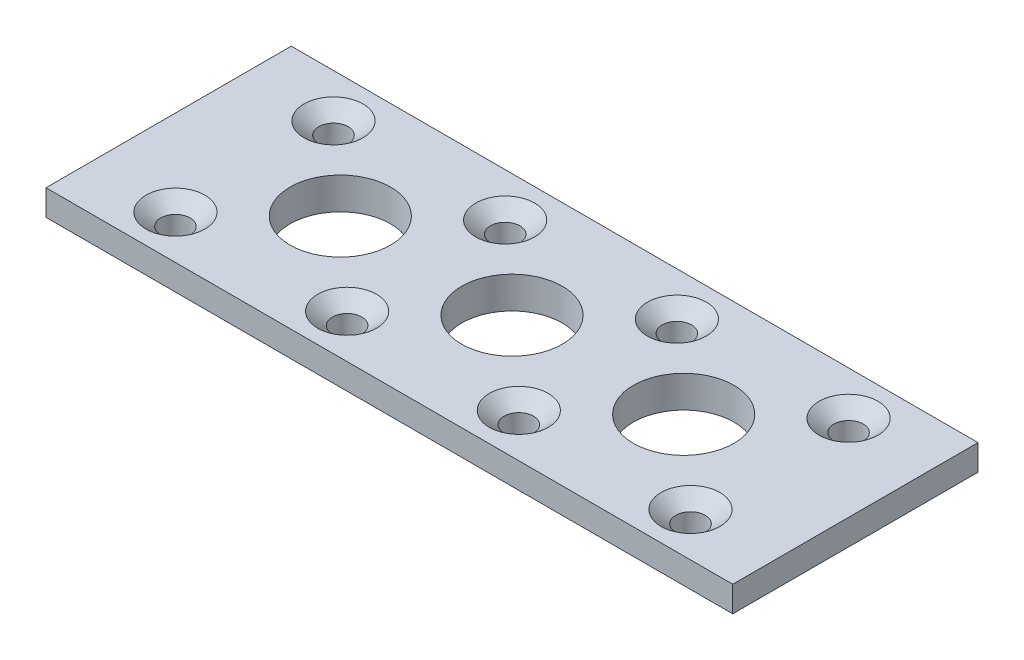
ISO-10303-21;
HEADER;
FILE_DESCRIPTION(('STEP AP214'),'2;1');
FILE_NAME('part.step','',(''),(''),'','','');
FILE_SCHEMA(('AUTOMOTIVE_DESIGN { 1 0 10303 214 1 1 1 1 }'));
ENDSEC;
DATA;
#1=APPLICATION_CONTEXT('core data for automotive mechanical design processes');
#2=APPLICATION_PROTOCOL_DEFINITION('international standard','automotive_design',2000,#1);
#3=PRODUCT_CONTEXT('',#1,'mechanical');
#4=PRODUCT('Part','Part','',(#3));
#5=PRODUCT_RELATED_PRODUCT_CATEGORY('part','',(#4));
#6=PRODUCT_DEFINITION_FORMATION('','',#4);
#7=PRODUCT_DEFINITION_CONTEXT('part definition',#1,'design');
#8=PRODUCT_DEFINITION('design','',#6,#7);
#9=PRODUCT_DEFINITION_SHAPE('','',#8);
#10=(LENGTH_UNIT() NAMED_UNIT(*) SI_UNIT(.MILLI.,.METRE.));
#11=(NAMED_UNIT(*) PLANE_ANGLE_UNIT() SI_UNIT($,.RADIAN.));
#12=(NAMED_UNIT(*) SI_UNIT($,.STERADIAN.) SOLID_ANGLE_UNIT());
#13=UNCERTAINTY_MEASURE_WITH_UNIT(LENGTH_MEASURE(1.E-05),#10,'distance_accuracy_value','');
#14=(GEOMETRIC_REPRESENTATION_CONTEXT(3) GLOBAL_UNCERTAINTY_ASSIGNED_CONTEXT((#13)) GLOBAL_UNIT_ASSIGNED_CONTEXT((#10,
#11,#12)) REPRESENTATION_CONTEXT('',''));
#15=CARTESIAN_POINT('',(0.,0.,0.));
#16=DIRECTION('',(0.,0.,1.));
#17=DIRECTION('',(1.,0.,0.));
#18=AXIS2_PLACEMENT_3D('',#15,#16,#17);
#19=CARTESIAN_POINT('',(0.,6.5,0.));
#20=DIRECTION('',(0.,-1.,0.));
#21=DIRECTION('',(0.,0.,-1.));
#22=AXIS2_PLACEMENT_3D('',#19,#20,#21);
#23=PLANE('',#22);
#24=CARTESIAN_POINT('',(17.5,6.5,16.1099));
#25=DIRECTION('',(0.,1.,0.));
#26=DIRECTION('',(0.,0.,1.));
#27=AXIS2_PLACEMENT_3D('',#24,#25,#26);
#28=CIRCLE('',#27,6.);
#29=CARTESIAN_POINT('',(17.5,6.5,22.1099));
#30=VERTEX_POINT('',#29);
#31=EDGE_CURVE('E173',#30,#30,#28,.T.);
#32=ORIENTED_EDGE('',*,*,#31,.F.);
#33=EDGE_LOOP('',(#32));
#34=FACE_BOUND('',#33,.T.);
#35=CARTESIAN_POINT('',(-17.5,6.5,16.1099));
#36=DIRECTION('',(0.,1.,0.));
#37=DIRECTION('',(0.,0.,1.));
#38=AXIS2_PLACEMENT_3D('',#35,#36,#37);
#39=CIRCLE('',#38,6.);
#40=CARTESIAN_POINT('',(-17.5,6.5,22.1099));
#41=VERTEX_POINT('',#40);
#42=EDGE_CURVE('E191',#41,#41,#39,.T.);
#43=ORIENTED_EDGE('',*,*,#42,.F.);
#44=EDGE_LOOP('',(#43));
#45=FACE_BOUND('',#44,.T.);
#46=CARTESIAN_POINT('',(35.,6.5,0.));
#47=DIRECTION('',(0.,1.,0.));
#48=DIRECTION('',(0.,0.,1.));
#49=AXIS2_PLACEMENT_3D('',#46,#47,#48);
#50=CIRCLE('',#49,10.25);
#51=CARTESIAN_POINT('',(35.,6.5,10.25));
#52=VERTEX_POINT('',#51);
#53=EDGE_CURVE('E231',#52,#52,#50,.T.);
#54=ORIENTED_EDGE('',*,*,#53,.F.);
#55=EDGE_LOOP('',(#54));
#56=FACE_BOUND('',#55,.T.);
#57=CARTESIAN_POINT('',(-35.,6.5,0.));
#58=DIRECTION('',(0.,1.,0.));
#59=DIRECTION('',(0.,0.,1.));
#60=AXIS2_PLACEMENT_3D('',#57,#58,#59);
#61=CIRCLE('',#60,10.25);
#62=CARTESIAN_POINT('',(-35.,6.5,10.25));
#63=VERTEX_POINT('',#62);
#64=EDGE_CURVE('E232',#63,#63,#61,.T.);
#65=ORIENTED_EDGE('',*,*,#64,.F.);
#66=EDGE_LOOP('',(#65));
#67=FACE_BOUND('',#66,.T.);
#68=CARTESIAN_POINT('',(0.,6.5,0.));
#69=DIRECTION('',(0.,1.,0.));
#70=DIRECTION('',(0.,0.,1.));
#71=AXIS2_PLACEMENT_3D('',#68,#69,#70);
#72=CIRCLE('',#71,10.25);
#73=CARTESIAN_POINT('',(0.,6.5,10.25));
#74=VERTEX_POINT('',#73);
#75=EDGE_CURVE('E127',#74,#74,#72,.T.);
#76=ORIENTED_EDGE('',*,*,#75,.F.);
#77=EDGE_LOOP('',(#76));
#78=FACE_BOUND('',#77,.T.);
#79=DIRECTION('',(0.,0.,-1.));
#80=VECTOR('',#79,1.);
#81=CARTESIAN_POINT('',(70.,6.5,25.));
#82=LINE('',#81,#80);
#83=CARTESIAN_POINT('',(70.,6.5,25.));
#84=VERTEX_POINT('',#83);
#85=CARTESIAN_POINT('',(70.,6.5,-25.));
#86=VERTEX_POINT('',#85);
#87=EDGE_CURVE('E108',#84,#86,#82,.T.);
#88=ORIENTED_EDGE('',*,*,#87,.T.);
#89=DIRECTION('',(-1.,0.,0.));
#90=VECTOR('',#89,1.);
#91=CARTESIAN_POINT('',(-70.,6.5,-25.));
#92=LINE('',#91,#90);
#93=CARTESIAN_POINT('',(-70.,6.5,-25.));
#94=VERTEX_POINT('',#93);
#95=EDGE_CURVE('E98',#86,#94,#92,.T.);
#96=ORIENTED_EDGE('',*,*,#95,.T.);
#97=DIRECTION('',(0.,0.,1.));
#98=VECTOR('',#97,1.);
#99=CARTESIAN_POINT('',(-70.,6.5,25.));
#100=LINE('',#99,#98);
#101=CARTESIAN_POINT('',(-70.,6.5,25.));
#102=VERTEX_POINT('',#101);
#103=EDGE_CURVE('E107',#94,#102,#100,.T.);
#104=ORIENTED_EDGE('',*,*,#103,.T.);
#105=DIRECTION('',(1.,0.,0.));
#106=VECTOR('',#105,1.);
#107=CARTESIAN_POINT('',(-70.,6.5,25.));
#108=LINE('',#107,#106);
#109=EDGE_CURVE('E113',#102,#84,#108,.T.);
#110=ORIENTED_EDGE('',*,*,#109,.T.);
#111=EDGE_LOOP('',(#88,#96,#104,#110));
#112=FACE_BOUND('',#111,.T.);
#113=CARTESIAN_POINT('',(-52.5,6.5,-16.11));
#114=DIRECTION('',(0.,1.,0.));
#115=DIRECTION('',(0.,0.,1.));
#116=AXIS2_PLACEMENT_3D('',#113,#114,#115);
#117=CIRCLE('',#116,6.);
#118=CARTESIAN_POINT('',(-52.5,6.5,-10.11));
#119=VERTEX_POINT('',#118);
#120=EDGE_CURVE('E218',#119,#119,#117,.T.);
#121=ORIENTED_EDGE('',*,*,#120,.F.);
#122=EDGE_LOOP('',(#121));
#123=FACE_BOUND('',#122,.T.);
#124=CARTESIAN_POINT('',(-52.5,6.5,16.1099));
#125=DIRECTION('',(0.,1.,0.));
#126=DIRECTION('',(0.,0.,1.));
#127=AXIS2_PLACEMENT_3D('',#124,#125,#126);
#128=CIRCLE('',#127,6.);
#129=CARTESIAN_POINT('',(-52.5,6.5,22.1099));
#130=VERTEX_POINT('',#129);
#131=EDGE_CURVE('E209',#130,#130,#128,.T.);
#132=ORIENTED_EDGE('',*,*,#131,.F.);
#133=EDGE_LOOP('',(#132));
#134=FACE_BOUND('',#133,.T.);
#135=CARTESIAN_POINT('',(-17.5,6.5,-16.11));
#136=DIRECTION('',(0.,1.,0.));
#137=DIRECTION('',(0.,0.,1.));
#138=AXIS2_PLACEMENT_3D('',#135,#136,#137);
#139=CIRCLE('',#138,6.);
#140=CARTESIAN_POINT('',(-17.5,6.5,-10.11));
#141=VERTEX_POINT('',#140);
#142=EDGE_CURVE('E200',#141,#141,#139,.T.);
#143=ORIENTED_EDGE('',*,*,#142,.F.);
#144=EDGE_LOOP('',(#143));
#145=FACE_BOUND('',#144,.T.);
#146=CARTESIAN_POINT('',(17.5,6.5,-16.11));
#147=DIRECTION('',(0.,1.,0.));
#148=DIRECTION('',(0.,0.,1.));
#149=AXIS2_PLACEMENT_3D('',#146,#147,#148);
#150=CIRCLE('',#149,6.);
#151=CARTESIAN_POINT('',(17.5,6.5,-10.11));
#152=VERTEX_POINT('',#151);
#153=EDGE_CURVE('E182',#152,#152,#150,.T.);
#154=ORIENTED_EDGE('',*,*,#153,.F.);
#155=EDGE_LOOP('',(#154));
#156=FACE_BOUND('',#155,.T.);
#157=CARTESIAN_POINT('',(52.5,6.5,-16.11));
#158=DIRECTION('',(0.,1.,0.));
#159=DIRECTION('',(0.,0.,1.));
#160=AXIS2_PLACEMENT_3D('',#157,#158,#159);
#161=CIRCLE('',#160,6.);
#162=CARTESIAN_POINT('',(52.5,6.5,-10.11));
#163=VERTEX_POINT('',#162);
#164=EDGE_CURVE('E164',#163,#163,#161,.T.);
#165=ORIENTED_EDGE('',*,*,#164,.F.);
#166=EDGE_LOOP('',(#165));
#167=FACE_BOUND('',#166,.T.);
#168=CARTESIAN_POINT('',(52.5,6.5,16.1099));
#169=DIRECTION('',(0.,1.,0.));
#170=DIRECTION('',(0.,0.,1.));
#171=AXIS2_PLACEMENT_3D('',#168,#169,#170);
#172=CIRCLE('',#171,6.);
#173=CARTESIAN_POINT('',(52.5,6.5,22.1099));
#174=VERTEX_POINT('',#173);
#175=EDGE_CURVE('E149',#174,#174,#172,.T.);
#176=ORIENTED_EDGE('',*,*,#175,.F.);
#177=EDGE_LOOP('',(#176));
#178=FACE_BOUND('',#177,.T.);
#179=ADVANCED_FACE('F43',(#34,#45,#56,#67,#78,#112,#123,#134,#145,#156,#167,#178),#23,.F.);
#180=CARTESIAN_POINT('',(70.,6.5,25.));
#181=DIRECTION('',(-1.,0.,0.));
#182=DIRECTION('',(0.,0.,1.));
#183=AXIS2_PLACEMENT_3D('',#180,#181,#182);
#184=PLANE('',#183);
#185=DIRECTION('',(0.,-1.,0.));
#186=VECTOR('',#185,1.);
#187=CARTESIAN_POINT('',(70.,6.5,25.));
#188=LINE('',#187,#186);
#189=CARTESIAN_POINT('',(70.,1.27000000000001,25.));
#190=VERTEX_POINT('',#189);
#191=EDGE_CURVE('E243',#84,#190,#188,.T.);
#192=ORIENTED_EDGE('',*,*,#191,.T.);
#193=DIRECTION('',(0.,0.,-1.));
#194=VECTOR('',#193,1.);
#195=CARTESIAN_POINT('',(70.,1.27000000000001,-25.));
#196=LINE('',#195,#194);
#197=CARTESIAN_POINT('',(70.,1.27000000000001,-25.));
#198=VERTEX_POINT('',#197);
#199=EDGE_CURVE('E53',#190,#198,#196,.T.);
#200=ORIENTED_EDGE('',*,*,#199,.T.);
#201=DIRECTION('',(0.,-1.,0.));
#202=VECTOR('',#201,1.);
#203=CARTESIAN_POINT('',(70.,6.5,-25.));
#204=LINE('',#203,#202);
#205=EDGE_CURVE('E101',#86,#198,#204,.T.);
#206=ORIENTED_EDGE('',*,*,#205,.F.);
#207=ORIENTED_EDGE('',*,*,#87,.F.);
#208=EDGE_LOOP('',(#192,#200,#206,#207));
#209=FACE_BOUND('',#208,.T.);
#210=ADVANCED_FACE('F116',(#209),#184,.F.);
#211=CARTESIAN_POINT('',(-70.,6.5,-25.));
#212=DIRECTION('',(0.,0.,1.));
#213=DIRECTION('',(1.,0.,0.));
#214=AXIS2_PLACEMENT_3D('',#211,#212,#213);
#215=PLANE('',#214);
#216=ORIENTED_EDGE('',*,*,#205,.T.);
#217=DIRECTION('',(-1.,0.,0.));
#218=VECTOR('',#217,1.);
#219=CARTESIAN_POINT('',(-70.,1.27000000000001,-25.));
#220=LINE('',#219,#218);
#221=CARTESIAN_POINT('',(-70.,1.27000000000001,-25.));
#222=VERTEX_POINT('',#221);
#223=EDGE_CURVE('E137',#198,#222,#220,.T.);
#224=ORIENTED_EDGE('',*,*,#223,.T.);
#225=DIRECTION('',(0.,-1.,0.));
#226=VECTOR('',#225,1.);
#227=CARTESIAN_POINT('',(-70.,6.5,-25.));
#228=LINE('',#227,#226);
#229=EDGE_CURVE('E104',#94,#222,#228,.T.);
#230=ORIENTED_EDGE('',*,*,#229,.F.);
#231=ORIENTED_EDGE('',*,*,#95,.F.);
#232=EDGE_LOOP('',(#216,#224,#230,#231));
#233=FACE_BOUND('',#232,.T.);
#234=ADVANCED_FACE('F100',(#233),#215,.F.);
#235=CARTESIAN_POINT('',(-70.,6.5,25.));
#236=DIRECTION('',(1.,0.,0.));
#237=DIRECTION('',(0.,0.,-1.));
#238=AXIS2_PLACEMENT_3D('',#235,#236,#237);
#239=PLANE('',#238);
#240=ORIENTED_EDGE('',*,*,#229,.T.);
#241=DIRECTION('',(0.,0.,1.));
#242=VECTOR('',#241,1.);
#243=CARTESIAN_POINT('',(-70.,1.27000000000001,25.));
#244=LINE('',#243,#242);
#245=CARTESIAN_POINT('',(-70.,1.27000000000001,25.));
#246=VERTEX_POINT('',#245);
#247=EDGE_CURVE('E117',#222,#246,#244,.T.);
#248=ORIENTED_EDGE('',*,*,#247,.T.);
#249=DIRECTION('',(0.,-1.,0.));
#250=VECTOR('',#249,1.);
#251=CARTESIAN_POINT('',(-70.,6.5,25.));
#252=LINE('',#251,#250);
#253=EDGE_CURVE('E122',#102,#246,#252,.T.);
#254=ORIENTED_EDGE('',*,*,#253,.F.);
#255=ORIENTED_EDGE('',*,*,#103,.F.);
#256=EDGE_LOOP('',(#240,#248,#254,#255));
#257=FACE_BOUND('',#256,.T.);
#258=ADVANCED_FACE('F247',(#257),#239,.F.);
#259=CARTESIAN_POINT('',(-70.,6.5,25.));
#260=DIRECTION('',(0.,0.,-1.));
#261=DIRECTION('',(-1.,0.,0.));
#262=AXIS2_PLACEMENT_3D('',#259,#260,#261);
#263=PLANE('',#262);
#264=ORIENTED_EDGE('',*,*,#253,.T.);
#265=DIRECTION('',(1.,0.,0.));
#266=VECTOR('',#265,1.);
#267=CARTESIAN_POINT('',(70.,1.27000000000001,25.));
#268=LINE('',#267,#266);
#269=EDGE_CURVE('E11',#246,#190,#268,.T.);
#270=ORIENTED_EDGE('',*,*,#269,.T.);
#271=ORIENTED_EDGE('',*,*,#191,.F.);
#272=ORIENTED_EDGE('',*,*,#109,.F.);
#273=EDGE_LOOP('',(#264,#270,#271,#272));
#274=FACE_BOUND('',#273,.T.);
#275=ADVANCED_FACE('F245',(#274),#263,.F.);
#276=CARTESIAN_POINT('',(0.,0.,0.));
#277=DIRECTION('',(0.,-1.,0.));
#278=DIRECTION('',(0.,0.,-1.));
#279=AXIS2_PLACEMENT_3D('',#276,#277,#278);
#280=PLANE('',#279);
#281=DIRECTION('',(-1.,0.,0.));
#282=VECTOR('',#281,1.);
#283=CARTESIAN_POINT('',(-70.,0.,23.73));
#284=LINE('',#283,#282);
#285=CARTESIAN_POINT('',(68.73,0.,23.73));
#286=VERTEX_POINT('',#285);
#287=CARTESIAN_POINT('',(-68.73,0.,23.73));
#288=VERTEX_POINT('',#287);
#289=EDGE_CURVE('E120',#286,#288,#284,.T.);
#290=ORIENTED_EDGE('',*,*,#289,.T.);
#291=DIRECTION('',(0.,0.,-1.));
#292=VECTOR('',#291,1.);
#293=CARTESIAN_POINT('',(-68.73,0.,-25.));
#294=LINE('',#293,#292);
#295=CARTESIAN_POINT('',(-68.73,0.,-23.73));
#296=VERTEX_POINT('',#295);
#297=EDGE_CURVE('E134',#288,#296,#294,.T.);
#298=ORIENTED_EDGE('',*,*,#297,.T.);
#299=DIRECTION('',(1.,0.,0.));
#300=VECTOR('',#299,1.);
#301=CARTESIAN_POINT('',(70.,0.,-23.73));
#302=LINE('',#301,#300);
#303=CARTESIAN_POINT('',(68.73,0.,-23.73));
#304=VERTEX_POINT('',#303);
#305=EDGE_CURVE('E132',#296,#304,#302,.T.);
#306=ORIENTED_EDGE('',*,*,#305,.T.);
#307=DIRECTION('',(0.,0.,1.));
#308=VECTOR('',#307,1.);
#309=CARTESIAN_POINT('',(68.73,0.,25.));
#310=LINE('',#309,#308);
#311=EDGE_CURVE('E130',#304,#286,#310,.T.);
#312=ORIENTED_EDGE('',*,*,#311,.T.);
#313=EDGE_LOOP('',(#290,#298,#306,#312));
#314=FACE_BOUND('',#313,.T.);
#315=CARTESIAN_POINT('',(52.5,0.,16.1099));
#316=DIRECTION('',(0.,-1.,0.));
#317=DIRECTION('',(0.,0.,-1.));
#318=AXIS2_PLACEMENT_3D('',#315,#316,#317);
#319=CIRCLE('',#318,3.);
#320=CARTESIAN_POINT('',(52.5,0.,13.1099));
#321=VERTEX_POINT('',#320);
#322=EDGE_CURVE('E159',#321,#321,#319,.T.);
#323=ORIENTED_EDGE('',*,*,#322,.F.);
#324=EDGE_LOOP('',(#323));
#325=FACE_BOUND('',#324,.T.);
#326=CARTESIAN_POINT('',(52.5,0.,-16.11));
#327=DIRECTION('',(0.,-1.,0.));
#328=DIRECTION('',(0.,0.,-1.));
#329=AXIS2_PLACEMENT_3D('',#326,#327,#328);
#330=CIRCLE('',#329,3.);
#331=CARTESIAN_POINT('',(52.5,0.,-19.11));
#332=VERTEX_POINT('',#331);
#333=EDGE_CURVE('E170',#332,#332,#330,.T.);
#334=ORIENTED_EDGE('',*,*,#333,.F.);
#335=EDGE_LOOP('',(#334));
#336=FACE_BOUND('',#335,.T.);
#337=CARTESIAN_POINT('',(17.5,0.,16.1099));
#338=DIRECTION('',(0.,-1.,0.));
#339=DIRECTION('',(0.,0.,-1.));
#340=AXIS2_PLACEMENT_3D('',#337,#338,#339);
#341=CIRCLE('',#340,3.);
#342=CARTESIAN_POINT('',(17.5,0.,13.1099));
#343=VERTEX_POINT('',#342);
#344=EDGE_CURVE('E179',#343,#343,#341,.T.);
#345=ORIENTED_EDGE('',*,*,#344,.F.);
#346=EDGE_LOOP('',(#345));
#347=FACE_BOUND('',#346,.T.);
#348=CARTESIAN_POINT('',(17.5,0.,-16.11));
#349=DIRECTION('',(0.,-1.,0.));
#350=DIRECTION('',(0.,0.,-1.));
#351=AXIS2_PLACEMENT_3D('',#348,#349,#350);
#352=CIRCLE('',#351,3.);
#353=CARTESIAN_POINT('',(17.5,0.,-19.11));
#354=VERTEX_POINT('',#353);
#355=EDGE_CURVE('E188',#354,#354,#352,.T.);
#356=ORIENTED_EDGE('',*,*,#355,.F.);
#357=EDGE_LOOP('',(#356));
#358=FACE_BOUND('',#357,.T.);
#359=CARTESIAN_POINT('',(-17.5,0.,16.1099));
#360=DIRECTION('',(0.,-1.,0.));
#361=DIRECTION('',(0.,0.,-1.));
#362=AXIS2_PLACEMENT_3D('',#359,#360,#361);
#363=CIRCLE('',#362,3.);
#364=CARTESIAN_POINT('',(-17.5,0.,13.1099));
#365=VERTEX_POINT('',#364);
#366=EDGE_CURVE('E197',#365,#365,#363,.T.);
#367=ORIENTED_EDGE('',*,*,#366,.F.);
#368=EDGE_LOOP('',(#367));
#369=FACE_BOUND('',#368,.T.);
#370=CARTESIAN_POINT('',(-17.5,0.,-16.11));
#371=DIRECTION('',(0.,-1.,0.));
#372=DIRECTION('',(0.,0.,-1.));
#373=AXIS2_PLACEMENT_3D('',#370,#371,#372);
#374=CIRCLE('',#373,3.);
#375=CARTESIAN_POINT('',(-17.5,0.,-19.11));
#376=VERTEX_POINT('',#375);
#377=EDGE_CURVE('E206',#376,#376,#374,.T.);
#378=ORIENTED_EDGE('',*,*,#377,.F.);
#379=EDGE_LOOP('',(#378));
#380=FACE_BOUND('',#379,.T.);
#381=CARTESIAN_POINT('',(-52.5,0.,16.1099));
#382=DIRECTION('',(0.,-1.,0.));
#383=DIRECTION('',(0.,0.,-1.));
#384=AXIS2_PLACEMENT_3D('',#381,#382,#383);
#385=CIRCLE('',#384,3.);
#386=CARTESIAN_POINT('',(-52.5,0.,13.1099));
#387=VERTEX_POINT('',#386);
#388=EDGE_CURVE('E215',#387,#387,#385,.T.);
#389=ORIENTED_EDGE('',*,*,#388,.F.);
#390=EDGE_LOOP('',(#389));
#391=FACE_BOUND('',#390,.T.);
#392=CARTESIAN_POINT('',(-52.5,0.,-16.11));
#393=DIRECTION('',(0.,-1.,0.));
#394=DIRECTION('',(0.,0.,-1.));
#395=AXIS2_PLACEMENT_3D('',#392,#393,#394);
#396=CIRCLE('',#395,3.);
#397=CARTESIAN_POINT('',(-52.5,0.,-19.11));
#398=VERTEX_POINT('',#397);
#399=EDGE_CURVE('E224',#398,#398,#396,.T.);
#400=ORIENTED_EDGE('',*,*,#399,.F.);
#401=EDGE_LOOP('',(#400));
#402=FACE_BOUND('',#401,.T.);
#403=CARTESIAN_POINT('',(35.,0.,0.));
#404=DIRECTION('',(0.,-1.,0.));
#405=DIRECTION('',(0.,0.,-1.));
#406=AXIS2_PLACEMENT_3D('',#403,#404,#405);
#407=CIRCLE('',#406,10.25);
#408=CARTESIAN_POINT('',(35.,0.,-10.25));
#409=VERTEX_POINT('',#408);
#410=EDGE_CURVE('E228',#409,#409,#407,.T.);
#411=ORIENTED_EDGE('',*,*,#410,.F.);
#412=EDGE_LOOP('',(#411));
#413=FACE_BOUND('',#412,.T.);
#414=CARTESIAN_POINT('',(-35.,0.,0.));
#415=DIRECTION('',(0.,-1.,0.));
#416=DIRECTION('',(0.,0.,-1.));
#417=AXIS2_PLACEMENT_3D('',#414,#415,#416);
#418=CIRCLE('',#417,10.25);
#419=CARTESIAN_POINT('',(-35.,0.,-10.25));
#420=VERTEX_POINT('',#419);
#421=EDGE_CURVE('E227',#420,#420,#418,.T.);
#422=ORIENTED_EDGE('',*,*,#421,.F.);
#423=EDGE_LOOP('',(#422));
#424=FACE_BOUND('',#423,.T.);
#425=CARTESIAN_POINT('',(0.,0.,0.));
#426=DIRECTION('',(0.,-1.,0.));
#427=DIRECTION('',(0.,0.,-1.));
#428=AXIS2_PLACEMENT_3D('',#425,#426,#427);
#429=CIRCLE('',#428,10.25);
#430=CARTESIAN_POINT('',(0.,0.,-10.25));
#431=VERTEX_POINT('',#430);
#432=EDGE_CURVE('E114',#431,#431,#429,.T.);
#433=ORIENTED_EDGE('',*,*,#432,.F.);
#434=EDGE_LOOP('',(#433));
#435=FACE_BOUND('',#434,.T.);
#436=ADVANCED_FACE('F279',(#314,#325,#336,#347,#358,#369,#380,#391,#402,#413,#424,#435),#280,.T.);
#437=CARTESIAN_POINT('',(0.,-6.2,0.));
#438=DIRECTION('',(0.,1.,0.));
#439=DIRECTION('',(0.,0.,1.));
#440=AXIS2_PLACEMENT_3D('',#437,#438,#439);
#441=CYLINDRICAL_SURFACE('',#440,10.25);
#442=ORIENTED_EDGE('',*,*,#432,.T.);
#443=EDGE_LOOP('',(#442));
#444=FACE_BOUND('',#443,.T.);
#445=ORIENTED_EDGE('',*,*,#75,.T.);
#446=EDGE_LOOP('',(#445));
#447=FACE_BOUND('',#446,.T.);
#448=ADVANCED_FACE('F277',(#444,#447),#441,.F.);
#449=CARTESIAN_POINT('',(-35.,-6.2,0.));
#450=DIRECTION('',(0.,1.,0.));
#451=DIRECTION('',(0.,0.,1.));
#452=AXIS2_PLACEMENT_3D('',#449,#450,#451);
#453=CYLINDRICAL_SURFACE('',#452,10.25);
#454=ORIENTED_EDGE('',*,*,#421,.T.);
#455=EDGE_LOOP('',(#454));
#456=FACE_BOUND('',#455,.T.);
#457=ORIENTED_EDGE('',*,*,#64,.T.);
#458=EDGE_LOOP('',(#457));
#459=FACE_BOUND('',#458,.T.);
#460=ADVANCED_FACE('F494',(#456,#459),#453,.F.);
#461=CARTESIAN_POINT('',(35.,-6.2,0.));
#462=DIRECTION('',(0.,1.,0.));
#463=DIRECTION('',(0.,0.,1.));
#464=AXIS2_PLACEMENT_3D('',#461,#462,#463);
#465=CYLINDRICAL_SURFACE('',#464,10.25);
#466=ORIENTED_EDGE('',*,*,#410,.T.);
#467=EDGE_LOOP('',(#466));
#468=FACE_BOUND('',#467,.T.);
#469=ORIENTED_EDGE('',*,*,#53,.T.);
#470=EDGE_LOOP('',(#469));
#471=FACE_BOUND('',#470,.T.);
#472=ADVANCED_FACE('F488',(#468,#471),#465,.F.);
#473=CARTESIAN_POINT('',(-52.5,6.5,-16.11));
#474=DIRECTION('',(0.,1.,0.));
#475=DIRECTION('',(0.,0.,1.));
#476=AXIS2_PLACEMENT_3D('',#473,#474,#475);
#477=CYLINDRICAL_SURFACE('',#476,3.);
#478=CARTESIAN_POINT('',(-52.5,3.98270110646816,-16.11));
#479=DIRECTION('',(0.,1.,0.));
#480=DIRECTION('',(0.,0.,1.));
#481=AXIS2_PLACEMENT_3D('',#478,#479,#480);
#482=CIRCLE('',#481,3.);
#483=CARTESIAN_POINT('',(-52.5,3.98270110646816,-13.11));
#484=VERTEX_POINT('',#483);
#485=EDGE_CURVE('E221',#484,#484,#482,.T.);
#486=ORIENTED_EDGE('',*,*,#485,.T.);
#487=EDGE_LOOP('',(#486));
#488=FACE_BOUND('',#487,.T.);
#489=ORIENTED_EDGE('',*,*,#399,.T.);
#490=EDGE_LOOP('',(#489));
#491=FACE_BOUND('',#490,.T.);
#492=ADVANCED_FACE('F479',(#488,#491),#477,.F.);
#493=CARTESIAN_POINT('',(-52.5,6.5,-16.11));
#494=DIRECTION('',(0.,1.,0.));
#495=DIRECTION('',(0.,0.,1.));
#496=AXIS2_PLACEMENT_3D('',#493,#494,#495);
#497=CONICAL_SURFACE('',#496,6.,0.872664625997164);
#498=ORIENTED_EDGE('',*,*,#485,.F.);
#499=EDGE_LOOP('',(#498));
#500=FACE_BOUND('',#499,.T.);
#501=ORIENTED_EDGE('',*,*,#120,.T.);
#502=EDGE_LOOP('',(#501));
#503=FACE_BOUND('',#502,.T.);
#504=ADVANCED_FACE('F467',(#500,#503),#497,.F.);
#505=CARTESIAN_POINT('',(-52.5,6.5,16.1099));
#506=DIRECTION('',(0.,1.,0.));
#507=DIRECTION('',(0.,0.,1.));
#508=AXIS2_PLACEMENT_3D('',#505,#506,#507);
#509=CYLINDRICAL_SURFACE('',#508,3.);
#510=CARTESIAN_POINT('',(-52.5,3.98270110646816,16.1099));
#511=DIRECTION('',(0.,1.,0.));
#512=DIRECTION('',(0.,0.,1.));
#513=AXIS2_PLACEMENT_3D('',#510,#511,#512);
#514=CIRCLE('',#513,3.);
#515=CARTESIAN_POINT('',(-52.5,3.98270110646816,19.1099));
#516=VERTEX_POINT('',#515);
#517=EDGE_CURVE('E212',#516,#516,#514,.T.);
#518=ORIENTED_EDGE('',*,*,#517,.T.);
#519=EDGE_LOOP('',(#518));
#520=FACE_BOUND('',#519,.T.);
#521=ORIENTED_EDGE('',*,*,#388,.T.);
#522=EDGE_LOOP('',(#521));
#523=FACE_BOUND('',#522,.T.);
#524=ADVANCED_FACE('F459',(#520,#523),#509,.F.);
#525=CARTESIAN_POINT('',(-52.5,6.5,16.1099));
#526=DIRECTION('',(0.,1.,0.));
#527=DIRECTION('',(0.,0.,1.));
#528=AXIS2_PLACEMENT_3D('',#525,#526,#527);
#529=CONICAL_SURFACE('',#528,6.,0.872664625997164);
#530=ORIENTED_EDGE('',*,*,#517,.F.);
#531=EDGE_LOOP('',(#530));
#532=FACE_BOUND('',#531,.T.);
#533=ORIENTED_EDGE('',*,*,#131,.T.);
#534=EDGE_LOOP('',(#533));
#535=FACE_BOUND('',#534,.T.);
#536=ADVANCED_FACE('F450',(#532,#535),#529,.F.);
#537=CARTESIAN_POINT('',(-17.5,6.5,-16.11));
#538=DIRECTION('',(0.,1.,0.));
#539=DIRECTION('',(0.,0.,1.));
#540=AXIS2_PLACEMENT_3D('',#537,#538,#539);
#541=CYLINDRICAL_SURFACE('',#540,3.);
#542=CARTESIAN_POINT('',(-17.5,3.98270110646816,-16.11));
#543=DIRECTION('',(0.,1.,0.));
#544=DIRECTION('',(0.,0.,1.));
#545=AXIS2_PLACEMENT_3D('',#542,#543,#544);
#546=CIRCLE('',#545,3.);
#547=CARTESIAN_POINT('',(-17.5,3.98270110646816,-13.11));
#548=VERTEX_POINT('',#547);
#549=EDGE_CURVE('E203',#548,#548,#546,.T.);
#550=ORIENTED_EDGE('',*,*,#549,.T.);
#551=EDGE_LOOP('',(#550));
#552=FACE_BOUND('',#551,.T.);
#553=ORIENTED_EDGE('',*,*,#377,.T.);
#554=EDGE_LOOP('',(#553));
#555=FACE_BOUND('',#554,.T.);
#556=ADVANCED_FACE('F441',(#552,#555),#541,.F.);
#557=CARTESIAN_POINT('',(-17.5,6.5,-16.11));
#558=DIRECTION('',(0.,1.,0.));
#559=DIRECTION('',(0.,0.,1.));
#560=AXIS2_PLACEMENT_3D('',#557,#558,#559);
#561=CONICAL_SURFACE('',#560,6.,0.872664625997165);
#562=ORIENTED_EDGE('',*,*,#549,.F.);
#563=EDGE_LOOP('',(#562));
#564=FACE_BOUND('',#563,.T.);
#565=ORIENTED_EDGE('',*,*,#142,.T.);
#566=EDGE_LOOP('',(#565));
#567=FACE_BOUND('',#566,.T.);
#568=ADVANCED_FACE('F432',(#564,#567),#561,.F.);
#569=CARTESIAN_POINT('',(-17.5,6.5,16.1099));
#570=DIRECTION('',(0.,1.,0.));
#571=DIRECTION('',(0.,0.,1.));
#572=AXIS2_PLACEMENT_3D('',#569,#570,#571);
#573=CYLINDRICAL_SURFACE('',#572,3.);
#574=CARTESIAN_POINT('',(-17.5,3.98270110646816,16.1099));
#575=DIRECTION('',(0.,1.,0.));
#576=DIRECTION('',(0.,0.,1.));
#577=AXIS2_PLACEMENT_3D('',#574,#575,#576);
#578=CIRCLE('',#577,3.);
#579=CARTESIAN_POINT('',(-17.5,3.98270110646816,19.1099));
#580=VERTEX_POINT('',#579);
#581=EDGE_CURVE('E194',#580,#580,#578,.T.);
#582=ORIENTED_EDGE('',*,*,#581,.T.);
#583=EDGE_LOOP('',(#582));
#584=FACE_BOUND('',#583,.T.);
#585=ORIENTED_EDGE('',*,*,#366,.T.);
#586=EDGE_LOOP('',(#585));
#587=FACE_BOUND('',#586,.T.);
#588=ADVANCED_FACE('F423',(#584,#587),#573,.F.);
#589=CARTESIAN_POINT('',(-17.5,6.5,16.1099));
#590=DIRECTION('',(0.,1.,0.));
#591=DIRECTION('',(0.,0.,1.));
#592=AXIS2_PLACEMENT_3D('',#589,#590,#591);
#593=CONICAL_SURFACE('',#592,6.,0.872664625997165);
#594=ORIENTED_EDGE('',*,*,#581,.F.);
#595=EDGE_LOOP('',(#594));
#596=FACE_BOUND('',#595,.T.);
#597=ORIENTED_EDGE('',*,*,#42,.T.);
#598=EDGE_LOOP('',(#597));
#599=FACE_BOUND('',#598,.T.);
#600=ADVANCED_FACE('F414',(#596,#599),#593,.F.);
#601=CARTESIAN_POINT('',(17.5,6.5,-16.11));
#602=DIRECTION('',(0.,1.,0.));
#603=DIRECTION('',(0.,0.,1.));
#604=AXIS2_PLACEMENT_3D('',#601,#602,#603);
#605=CYLINDRICAL_SURFACE('',#604,3.);
#606=CARTESIAN_POINT('',(17.5,3.98270110646816,-16.11));
#607=DIRECTION('',(0.,1.,0.));
#608=DIRECTION('',(0.,0.,1.));
#609=AXIS2_PLACEMENT_3D('',#606,#607,#608);
#610=CIRCLE('',#609,3.);
#611=CARTESIAN_POINT('',(17.5,3.98270110646816,-13.11));
#612=VERTEX_POINT('',#611);
#613=EDGE_CURVE('E185',#612,#612,#610,.T.);
#614=ORIENTED_EDGE('',*,*,#613,.T.);
#615=EDGE_LOOP('',(#614));
#616=FACE_BOUND('',#615,.T.);
#617=ORIENTED_EDGE('',*,*,#355,.T.);
#618=EDGE_LOOP('',(#617));
#619=FACE_BOUND('',#618,.T.);
#620=ADVANCED_FACE('F405',(#616,#619),#605,.F.);
#621=CARTESIAN_POINT('',(17.5,6.5,-16.11));
#622=DIRECTION('',(0.,1.,0.));
#623=DIRECTION('',(0.,0.,1.));
#624=AXIS2_PLACEMENT_3D('',#621,#622,#623);
#625=CONICAL_SURFACE('',#624,6.,0.872664625997165);
#626=ORIENTED_EDGE('',*,*,#613,.F.);
#627=EDGE_LOOP('',(#626));
#628=FACE_BOUND('',#627,.T.);
#629=ORIENTED_EDGE('',*,*,#153,.T.);
#630=EDGE_LOOP('',(#629));
#631=FACE_BOUND('',#630,.T.);
#632=ADVANCED_FACE('F396',(#628,#631),#625,.F.);
#633=CARTESIAN_POINT('',(17.5,6.5,16.1099));
#634=DIRECTION('',(0.,1.,0.));
#635=DIRECTION('',(0.,0.,1.));
#636=AXIS2_PLACEMENT_3D('',#633,#634,#635);
#637=CYLINDRICAL_SURFACE('',#636,3.);
#638=CARTESIAN_POINT('',(17.5,3.98270110646816,16.1099));
#639=DIRECTION('',(0.,1.,0.));
#640=DIRECTION('',(0.,0.,1.));
#641=AXIS2_PLACEMENT_3D('',#638,#639,#640);
#642=CIRCLE('',#641,3.);
#643=CARTESIAN_POINT('',(17.5,3.98270110646816,19.1099));
#644=VERTEX_POINT('',#643);
#645=EDGE_CURVE('E176',#644,#644,#642,.T.);
#646=ORIENTED_EDGE('',*,*,#645,.T.);
#647=EDGE_LOOP('',(#646));
#648=FACE_BOUND('',#647,.T.);
#649=ORIENTED_EDGE('',*,*,#344,.T.);
#650=EDGE_LOOP('',(#649));
#651=FACE_BOUND('',#650,.T.);
#652=ADVANCED_FACE('F387',(#648,#651),#637,.F.);
#653=CARTESIAN_POINT('',(17.5,6.5,16.1099));
#654=DIRECTION('',(0.,1.,0.));
#655=DIRECTION('',(0.,0.,1.));
#656=AXIS2_PLACEMENT_3D('',#653,#654,#655);
#657=CONICAL_SURFACE('',#656,6.,0.872664625997165);
#658=ORIENTED_EDGE('',*,*,#645,.F.);
#659=EDGE_LOOP('',(#658));
#660=FACE_BOUND('',#659,.T.);
#661=ORIENTED_EDGE('',*,*,#31,.T.);
#662=EDGE_LOOP('',(#661));
#663=FACE_BOUND('',#662,.T.);
#664=ADVANCED_FACE('F378',(#660,#663),#657,.F.);
#665=CARTESIAN_POINT('',(52.5,6.5,-16.11));
#666=DIRECTION('',(0.,1.,0.));
#667=DIRECTION('',(0.,0.,1.));
#668=AXIS2_PLACEMENT_3D('',#665,#666,#667);
#669=CYLINDRICAL_SURFACE('',#668,3.);
#670=CARTESIAN_POINT('',(52.5,3.98270110646816,-16.11));
#671=DIRECTION('',(0.,1.,0.));
#672=DIRECTION('',(0.,0.,1.));
#673=AXIS2_PLACEMENT_3D('',#670,#671,#672);
#674=CIRCLE('',#673,3.);
#675=CARTESIAN_POINT('',(52.5,3.98270110646816,-13.11));
#676=VERTEX_POINT('',#675);
#677=EDGE_CURVE('E167',#676,#676,#674,.T.);
#678=ORIENTED_EDGE('',*,*,#677,.T.);
#679=EDGE_LOOP('',(#678));
#680=FACE_BOUND('',#679,.T.);
#681=ORIENTED_EDGE('',*,*,#333,.T.);
#682=EDGE_LOOP('',(#681));
#683=FACE_BOUND('',#682,.T.);
#684=ADVANCED_FACE('F369',(#680,#683),#669,.F.);
#685=CARTESIAN_POINT('',(52.5,6.5,-16.11));
#686=DIRECTION('',(0.,1.,0.));
#687=DIRECTION('',(0.,0.,1.));
#688=AXIS2_PLACEMENT_3D('',#685,#686,#687);
#689=CONICAL_SURFACE('',#688,6.,0.872664625997164);
#690=ORIENTED_EDGE('',*,*,#677,.F.);
#691=EDGE_LOOP('',(#690));
#692=FACE_BOUND('',#691,.T.);
#693=ORIENTED_EDGE('',*,*,#164,.T.);
#694=EDGE_LOOP('',(#693));
#695=FACE_BOUND('',#694,.T.);
#696=ADVANCED_FACE('F360',(#692,#695),#689,.F.);
#697=CARTESIAN_POINT('',(52.5,6.5,16.1099));
#698=DIRECTION('',(0.,1.,0.));
#699=DIRECTION('',(0.,0.,1.));
#700=AXIS2_PLACEMENT_3D('',#697,#698,#699);
#701=CYLINDRICAL_SURFACE('',#700,3.);
#702=CARTESIAN_POINT('',(52.5,3.98270110646816,16.1099));
#703=DIRECTION('',(0.,1.,0.));
#704=DIRECTION('',(0.,0.,1.));
#705=AXIS2_PLACEMENT_3D('',#702,#703,#704);
#706=CIRCLE('',#705,3.);
#707=CARTESIAN_POINT('',(52.5,3.98270110646816,19.1099));
#708=VERTEX_POINT('',#707);
#709=EDGE_CURVE('E154',#708,#708,#706,.T.);
#710=ORIENTED_EDGE('',*,*,#709,.T.);
#711=EDGE_LOOP('',(#710));
#712=FACE_BOUND('',#711,.T.);
#713=ORIENTED_EDGE('',*,*,#322,.T.);
#714=EDGE_LOOP('',(#713));
#715=FACE_BOUND('',#714,.T.);
#716=ADVANCED_FACE('F351',(#712,#715),#701,.F.);
#717=CARTESIAN_POINT('',(52.5,6.5,16.1099));
#718=DIRECTION('',(0.,1.,0.));
#719=DIRECTION('',(0.,0.,1.));
#720=AXIS2_PLACEMENT_3D('',#717,#718,#719);
#721=CONICAL_SURFACE('',#720,6.,0.872664625997164);
#722=ORIENTED_EDGE('',*,*,#709,.F.);
#723=EDGE_LOOP('',(#722));
#724=FACE_BOUND('',#723,.T.);
#725=ORIENTED_EDGE('',*,*,#175,.T.);
#726=EDGE_LOOP('',(#725));
#727=FACE_BOUND('',#726,.T.);
#728=ADVANCED_FACE('F325',(#724,#727),#721,.F.);
#729=CARTESIAN_POINT('',(70.,1.27000000000001,25.));
#730=DIRECTION('',(0.707106781186551,-0.707106781186544,0.));
#731=DIRECTION('',(0.,0.,1.));
#732=AXIS2_PLACEMENT_3D('',#729,#730,#731);
#733=PLANE('',#732);
#734=DIRECTION('',(0.577350269189624,0.57735026918963,0.577350269189624));
#735=VECTOR('',#734,1.);
#736=CARTESIAN_POINT('',(23.3333333333337,-45.3966666666668,-21.6666666666663));
#737=LINE('',#736,#735);
#738=EDGE_CURVE('E143',#286,#190,#737,.T.);
#739=ORIENTED_EDGE('',*,*,#738,.F.);
#740=ORIENTED_EDGE('',*,*,#311,.F.);
#741=DIRECTION('',(0.577350269189624,0.57735026918963,-0.577350269189624));
#742=VECTOR('',#741,1.);
#743=CARTESIAN_POINT('',(53.3333333333334,-15.3966666666667,-8.33333333333346));
#744=LINE('',#743,#742);
#745=EDGE_CURVE('E48',#198,#304,#744,.F.);
#746=ORIENTED_EDGE('',*,*,#745,.F.);
#747=ORIENTED_EDGE('',*,*,#199,.F.);
#748=EDGE_LOOP('',(#739,#740,#746,#747));
#749=FACE_BOUND('',#748,.T.);
#750=ADVANCED_FACE('F46',(#749),#733,.T.);
#751=CARTESIAN_POINT('',(-70.,1.27000000000001,-25.));
#752=DIRECTION('',(0.,-0.707106781186544,-0.707106781186551));
#753=DIRECTION('',(1.,0.,0.));
#754=AXIS2_PLACEMENT_3D('',#751,#752,#753);
#755=PLANE('',#754);
#756=ORIENTED_EDGE('',*,*,#745,.T.);
#757=ORIENTED_EDGE('',*,*,#305,.F.);
#758=DIRECTION('',(-0.577350269189624,0.57735026918963,-0.577350269189624));
#759=VECTOR('',#758,1.);
#760=CARTESIAN_POINT('',(-70.,1.27000000000001,-25.));
#761=LINE('',#760,#759);
#762=EDGE_CURVE('E142',#222,#296,#761,.F.);
#763=ORIENTED_EDGE('',*,*,#762,.F.);
#764=ORIENTED_EDGE('',*,*,#223,.F.);
#765=EDGE_LOOP('',(#756,#757,#763,#764));
#766=FACE_BOUND('',#765,.T.);
#767=ADVANCED_FACE('F256',(#766),#755,.T.);
#768=CARTESIAN_POINT('',(-70.,1.27000000000001,25.));
#769=DIRECTION('',(0.,-0.707106781186544,0.707106781186551));
#770=DIRECTION('',(-1.,0.,0.));
#771=AXIS2_PLACEMENT_3D('',#768,#769,#770);
#772=PLANE('',#771);
#773=ORIENTED_EDGE('',*,*,#738,.T.);
#774=ORIENTED_EDGE('',*,*,#269,.F.);
#775=DIRECTION('',(0.577350269189624,-0.57735026918963,-0.577350269189624));
#776=VECTOR('',#775,1.);
#777=CARTESIAN_POINT('',(-70.,1.27000000000001,25.));
#778=LINE('',#777,#776);
#779=EDGE_CURVE('E140',#288,#246,#778,.F.);
#780=ORIENTED_EDGE('',*,*,#779,.F.);
#781=ORIENTED_EDGE('',*,*,#289,.F.);
#782=EDGE_LOOP('',(#773,#774,#780,#781));
#783=FACE_BOUND('',#782,.T.);
#784=ADVANCED_FACE('F254',(#783),#772,.T.);
#785=CARTESIAN_POINT('',(-70.,1.27000000000001,25.));
#786=DIRECTION('',(-0.707106781186551,-0.707106781186544,0.));
#787=DIRECTION('',(0.,0.,-1.));
#788=AXIS2_PLACEMENT_3D('',#785,#786,#787);
#789=PLANE('',#788);
#790=ORIENTED_EDGE('',*,*,#762,.T.);
#791=ORIENTED_EDGE('',*,*,#297,.F.);
#792=ORIENTED_EDGE('',*,*,#779,.T.);
#793=ORIENTED_EDGE('',*,*,#247,.F.);
#794=EDGE_LOOP('',(#790,#791,#792,#793));
#795=FACE_BOUND('',#794,.T.);
#796=ADVANCED_FACE('F251',(#795),#789,.T.);
#797=CLOSED_SHELL('',(#179,#210,#234,#258,#275,#436,#448,#460,#472,#492,#504,#524,#536,#556,
#568,#588,#600,#620,#632,#652,#664,#684,#696,#716,#728,#750,#767,#784,#796));
#798=MANIFOLD_SOLID_BREP('B2',#797);
#799=ADVANCED_BREP_SHAPE_REPRESENTATION('',(#18,#798),#14);
#800=SHAPE_DEFINITION_REPRESENTATION(#9,#799);
ENDSEC;
END-ISO-10303-21;
